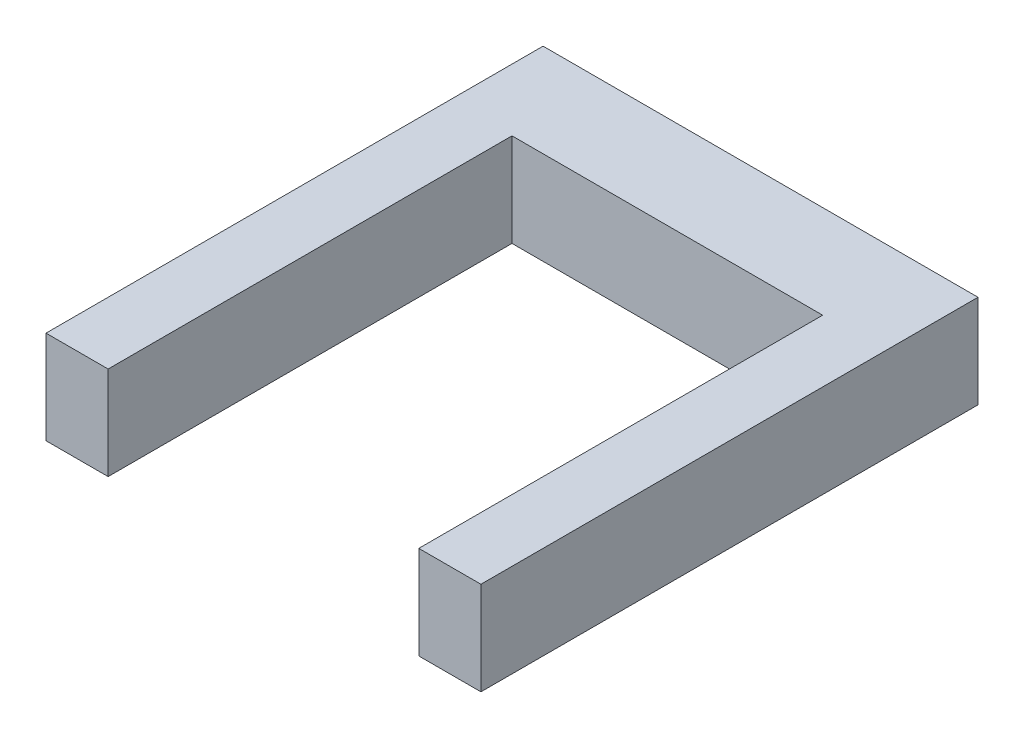
ISO-10303-21;
HEADER;
FILE_DESCRIPTION(('STEP AP214'),'2;1');
FILE_NAME('part.step','',(''),(''),'','','');
FILE_SCHEMA(('AUTOMOTIVE_DESIGN { 1 0 10303 214 1 1 1 1 }'));
ENDSEC;
DATA;
#1=APPLICATION_CONTEXT('core data for automotive mechanical design processes');
#2=APPLICATION_PROTOCOL_DEFINITION('international standard','automotive_design',2000,#1);
#3=PRODUCT_CONTEXT('',#1,'mechanical');
#4=PRODUCT('Part','Part','',(#3));
#5=PRODUCT_RELATED_PRODUCT_CATEGORY('part','',(#4));
#6=PRODUCT_DEFINITION_FORMATION('','',#4);
#7=PRODUCT_DEFINITION_CONTEXT('part definition',#1,'design');
#8=PRODUCT_DEFINITION('design','',#6,#7);
#9=PRODUCT_DEFINITION_SHAPE('','',#8);
#10=(LENGTH_UNIT() NAMED_UNIT(*) SI_UNIT(.MILLI.,.METRE.));
#11=(NAMED_UNIT(*) PLANE_ANGLE_UNIT() SI_UNIT($,.RADIAN.));
#12=(NAMED_UNIT(*) SI_UNIT($,.STERADIAN.) SOLID_ANGLE_UNIT());
#13=UNCERTAINTY_MEASURE_WITH_UNIT(LENGTH_MEASURE(1.E-05),#10,'distance_accuracy_value','');
#14=(GEOMETRIC_REPRESENTATION_CONTEXT(3) GLOBAL_UNCERTAINTY_ASSIGNED_CONTEXT((#13)) GLOBAL_UNIT_ASSIGNED_CONTEXT((#10,
#11,#12)) REPRESENTATION_CONTEXT('',''));
#15=CARTESIAN_POINT('',(0.,0.,0.));
#16=DIRECTION('',(0.,0.,1.));
#17=DIRECTION('',(1.,0.,0.));
#18=AXIS2_PLACEMENT_3D('',#15,#16,#17);
#19=CARTESIAN_POINT('',(-355.6,152.4,406.4));
#20=DIRECTION('',(0.,0.,-1.));
#21=DIRECTION('',(-1.,0.,0.));
#22=AXIS2_PLACEMENT_3D('',#19,#20,#21);
#23=PLANE('',#22);
#24=DIRECTION('',(1.,0.,0.));
#25=VECTOR('',#24,1.);
#26=CARTESIAN_POINT('',(-355.6,0.,406.4));
#27=LINE('',#26,#25);
#28=CARTESIAN_POINT('',(-355.6,0.,406.4));
#29=VERTEX_POINT('',#28);
#30=CARTESIAN_POINT('',(-254.,0.,406.4));
#31=VERTEX_POINT('',#30);
#32=EDGE_CURVE('E121',#29,#31,#27,.T.);
#33=ORIENTED_EDGE('',*,*,#32,.T.);
#34=DIRECTION('',(0.,1.,0.));
#35=VECTOR('',#34,1.);
#36=CARTESIAN_POINT('',(-254.,0.,406.4));
#37=LINE('',#36,#35);
#38=CARTESIAN_POINT('',(-254.,152.4,406.4));
#39=VERTEX_POINT('',#38);
#40=EDGE_CURVE('E109',#31,#39,#37,.T.);
#41=ORIENTED_EDGE('',*,*,#40,.T.);
#42=DIRECTION('',(1.,0.,0.));
#43=VECTOR('',#42,1.);
#44=CARTESIAN_POINT('',(-355.6,152.4,406.4));
#45=LINE('',#44,#43);
#46=CARTESIAN_POINT('',(-355.6,152.4,406.4));
#47=VERTEX_POINT('',#46);
#48=EDGE_CURVE('E87',#47,#39,#45,.T.);
#49=ORIENTED_EDGE('',*,*,#48,.F.);
#50=DIRECTION('',(0.,-1.,0.));
#51=VECTOR('',#50,1.);
#52=CARTESIAN_POINT('',(-355.6,152.4,406.4));
#53=LINE('',#52,#51);
#54=EDGE_CURVE('E11',#47,#29,#53,.T.);
#55=ORIENTED_EDGE('',*,*,#54,.T.);
#56=EDGE_LOOP('',(#33,#41,#49,#55));
#57=FACE_BOUND('',#56,.T.);
#58=ADVANCED_FACE('F35',(#57),#23,.F.);
#59=CARTESIAN_POINT('',(-355.6,152.4,-406.4));
#60=DIRECTION('',(1.,0.,0.));
#61=DIRECTION('',(0.,0.,-1.));
#62=AXIS2_PLACEMENT_3D('',#59,#60,#61);
#63=PLANE('',#62);
#64=DIRECTION('',(0.,0.,1.));
#65=VECTOR('',#64,1.);
#66=CARTESIAN_POINT('',(-355.6,0.,-406.4));
#67=LINE('',#66,#65);
#68=CARTESIAN_POINT('',(-355.6,0.,-406.4));
#69=VERTEX_POINT('',#68);
#70=EDGE_CURVE('E132',#69,#29,#67,.T.);
#71=ORIENTED_EDGE('',*,*,#70,.T.);
#72=ORIENTED_EDGE('',*,*,#54,.F.);
#73=DIRECTION('',(0.,0.,1.));
#74=VECTOR('',#73,1.);
#75=CARTESIAN_POINT('',(-355.6,152.4,-406.4));
#76=LINE('',#75,#74);
#77=CARTESIAN_POINT('',(-355.6,152.4,-406.4));
#78=VERTEX_POINT('',#77);
#79=EDGE_CURVE('E137',#78,#47,#76,.T.);
#80=ORIENTED_EDGE('',*,*,#79,.F.);
#81=DIRECTION('',(0.,-1.,0.));
#82=VECTOR('',#81,1.);
#83=CARTESIAN_POINT('',(-355.6,152.4,-406.4));
#84=LINE('',#83,#82);
#85=EDGE_CURVE('E138',#78,#69,#84,.T.);
#86=ORIENTED_EDGE('',*,*,#85,.T.);
#87=EDGE_LOOP('',(#71,#72,#80,#86));
#88=FACE_BOUND('',#87,.T.);
#89=ADVANCED_FACE('F37',(#88),#63,.F.);
#90=CARTESIAN_POINT('',(254.,152.4,406.4));
#91=VERTEX_POINT('',#90);
#92=CARTESIAN_POINT('',(355.6,152.4,406.4));
#93=VERTEX_POINT('',#92);
#94=EDGE_CURVE('E163',#91,#93,#45,.T.);
#95=ORIENTED_EDGE('',*,*,#94,.F.);
#96=DIRECTION('',(0.,1.,0.));
#97=VECTOR('',#96,1.);
#98=CARTESIAN_POINT('',(254.,0.,406.4));
#99=LINE('',#98,#97);
#100=CARTESIAN_POINT('',(254.,0.,406.4));
#101=VERTEX_POINT('',#100);
#102=EDGE_CURVE('E116',#101,#91,#99,.T.);
#103=ORIENTED_EDGE('',*,*,#102,.F.);
#104=CARTESIAN_POINT('',(355.6,0.,406.4));
#105=VERTEX_POINT('',#104);
#106=EDGE_CURVE('E129',#101,#105,#27,.T.);
#107=ORIENTED_EDGE('',*,*,#106,.T.);
#108=DIRECTION('',(0.,-1.,0.));
#109=VECTOR('',#108,1.);
#110=CARTESIAN_POINT('',(355.6,152.4,406.4));
#111=LINE('',#110,#109);
#112=EDGE_CURVE('E43',#93,#105,#111,.T.);
#113=ORIENTED_EDGE('',*,*,#112,.F.);
#114=EDGE_LOOP('',(#95,#103,#107,#113));
#115=FACE_BOUND('',#114,.T.);
#116=ADVANCED_FACE('F178',(#115),#23,.F.);
#117=CARTESIAN_POINT('',(355.6,152.4,-406.4));
#118=DIRECTION('',(-1.,0.,0.));
#119=DIRECTION('',(0.,0.,1.));
#120=AXIS2_PLACEMENT_3D('',#117,#118,#119);
#121=PLANE('',#120);
#122=DIRECTION('',(0.,0.,-1.));
#123=VECTOR('',#122,1.);
#124=CARTESIAN_POINT('',(355.6,0.,-406.4));
#125=LINE('',#124,#123);
#126=CARTESIAN_POINT('',(355.6,0.,-406.4));
#127=VERTEX_POINT('',#126);
#128=EDGE_CURVE('E128',#105,#127,#125,.T.);
#129=ORIENTED_EDGE('',*,*,#128,.T.);
#130=DIRECTION('',(0.,-1.,0.));
#131=VECTOR('',#130,1.);
#132=CARTESIAN_POINT('',(355.6,152.4,-406.4));
#133=LINE('',#132,#131);
#134=CARTESIAN_POINT('',(355.6,152.4,-406.4));
#135=VERTEX_POINT('',#134);
#136=EDGE_CURVE('E140',#135,#127,#133,.T.);
#137=ORIENTED_EDGE('',*,*,#136,.F.);
#138=DIRECTION('',(0.,0.,-1.));
#139=VECTOR('',#138,1.);
#140=CARTESIAN_POINT('',(355.6,152.4,-406.4));
#141=LINE('',#140,#139);
#142=EDGE_CURVE('E148',#93,#135,#141,.T.);
#143=ORIENTED_EDGE('',*,*,#142,.F.);
#144=ORIENTED_EDGE('',*,*,#112,.T.);
#145=EDGE_LOOP('',(#129,#137,#143,#144));
#146=FACE_BOUND('',#145,.T.);
#147=ADVANCED_FACE('F146',(#146),#121,.F.);
#148=CARTESIAN_POINT('',(-355.6,152.4,-406.4));
#149=DIRECTION('',(0.,0.,1.));
#150=DIRECTION('',(1.,0.,0.));
#151=AXIS2_PLACEMENT_3D('',#148,#149,#150);
#152=PLANE('',#151);
#153=DIRECTION('',(-1.,0.,0.));
#154=VECTOR('',#153,1.);
#155=CARTESIAN_POINT('',(-355.6,0.,-406.4));
#156=LINE('',#155,#154);
#157=EDGE_CURVE('E80',#127,#69,#156,.T.);
#158=ORIENTED_EDGE('',*,*,#157,.T.);
#159=ORIENTED_EDGE('',*,*,#85,.F.);
#160=DIRECTION('',(-1.,0.,0.));
#161=VECTOR('',#160,1.);
#162=CARTESIAN_POINT('',(-355.6,152.4,-406.4));
#163=LINE('',#162,#161);
#164=EDGE_CURVE('E59',#135,#78,#163,.T.);
#165=ORIENTED_EDGE('',*,*,#164,.F.);
#166=ORIENTED_EDGE('',*,*,#136,.T.);
#167=EDGE_LOOP('',(#158,#159,#165,#166));
#168=FACE_BOUND('',#167,.T.);
#169=ADVANCED_FACE('F167',(#168),#152,.F.);
#170=CARTESIAN_POINT('',(0.,152.4,0.));
#171=DIRECTION('',(0.,1.,0.));
#172=DIRECTION('',(0.,0.,1.));
#173=AXIS2_PLACEMENT_3D('',#170,#171,#172);
#174=PLANE('',#173);
#175=DIRECTION('',(0.,0.,1.));
#176=VECTOR('',#175,1.);
#177=CARTESIAN_POINT('',(-254.,152.4,406.4));
#178=LINE('',#177,#176);
#179=CARTESIAN_POINT('',(-254.,152.4,-254.));
#180=VERTEX_POINT('',#179);
#181=EDGE_CURVE('E114',#180,#39,#178,.T.);
#182=ORIENTED_EDGE('',*,*,#181,.F.);
#183=DIRECTION('',(-1.,0.,0.));
#184=VECTOR('',#183,1.);
#185=CARTESIAN_POINT('',(-254.,152.4,-254.));
#186=LINE('',#185,#184);
#187=CARTESIAN_POINT('',(254.,152.4,-254.));
#188=VERTEX_POINT('',#187);
#189=EDGE_CURVE('E124',#188,#180,#186,.T.);
#190=ORIENTED_EDGE('',*,*,#189,.F.);
#191=DIRECTION('',(0.,0.,-1.));
#192=VECTOR('',#191,1.);
#193=CARTESIAN_POINT('',(254.,152.4,406.4));
#194=LINE('',#193,#192);
#195=EDGE_CURVE('E170',#91,#188,#194,.T.);
#196=ORIENTED_EDGE('',*,*,#195,.F.);
#197=ORIENTED_EDGE('',*,*,#94,.T.);
#198=ORIENTED_EDGE('',*,*,#142,.T.);
#199=ORIENTED_EDGE('',*,*,#164,.T.);
#200=ORIENTED_EDGE('',*,*,#79,.T.);
#201=ORIENTED_EDGE('',*,*,#48,.T.);
#202=EDGE_LOOP('',(#182,#190,#196,#197,#198,#199,#200,#201));
#203=FACE_BOUND('',#202,.T.);
#204=ADVANCED_FACE('F165',(#203),#174,.T.);
#205=CARTESIAN_POINT('',(0.,0.,0.));
#206=DIRECTION('',(0.,1.,0.));
#207=DIRECTION('',(0.,0.,1.));
#208=AXIS2_PLACEMENT_3D('',#205,#206,#207);
#209=PLANE('',#208);
#210=DIRECTION('',(-1.,0.,0.));
#211=VECTOR('',#210,1.);
#212=CARTESIAN_POINT('',(-254.,0.,-254.));
#213=LINE('',#212,#211);
#214=CARTESIAN_POINT('',(254.,0.,-254.));
#215=VERTEX_POINT('',#214);
#216=CARTESIAN_POINT('',(-254.,0.,-254.));
#217=VERTEX_POINT('',#216);
#218=EDGE_CURVE('E50',#215,#217,#213,.T.);
#219=ORIENTED_EDGE('',*,*,#218,.T.);
#220=DIRECTION('',(0.,0.,1.));
#221=VECTOR('',#220,1.);
#222=CARTESIAN_POINT('',(-254.,0.,406.4));
#223=LINE('',#222,#221);
#224=EDGE_CURVE('E112',#217,#31,#223,.T.);
#225=ORIENTED_EDGE('',*,*,#224,.T.);
#226=ORIENTED_EDGE('',*,*,#32,.F.);
#227=ORIENTED_EDGE('',*,*,#70,.F.);
#228=ORIENTED_EDGE('',*,*,#157,.F.);
#229=ORIENTED_EDGE('',*,*,#128,.F.);
#230=ORIENTED_EDGE('',*,*,#106,.F.);
#231=DIRECTION('',(0.,0.,-1.));
#232=VECTOR('',#231,1.);
#233=CARTESIAN_POINT('',(254.,0.,406.4));
#234=LINE('',#233,#232);
#235=EDGE_CURVE('E123',#101,#215,#234,.T.);
#236=ORIENTED_EDGE('',*,*,#235,.T.);
#237=EDGE_LOOP('',(#219,#225,#226,#227,#228,#229,#230,#236));
#238=FACE_BOUND('',#237,.T.);
#239=ADVANCED_FACE('F119',(#238),#209,.F.);
#240=CARTESIAN_POINT('',(-254.,0.,406.4));
#241=DIRECTION('',(-1.,0.,0.));
#242=DIRECTION('',(0.,0.,1.));
#243=AXIS2_PLACEMENT_3D('',#240,#241,#242);
#244=PLANE('',#243);
#245=ORIENTED_EDGE('',*,*,#181,.T.);
#246=ORIENTED_EDGE('',*,*,#40,.F.);
#247=ORIENTED_EDGE('',*,*,#224,.F.);
#248=DIRECTION('',(0.,1.,0.));
#249=VECTOR('',#248,1.);
#250=CARTESIAN_POINT('',(-254.,0.,-254.));
#251=LINE('',#250,#249);
#252=EDGE_CURVE('E153',#217,#180,#251,.T.);
#253=ORIENTED_EDGE('',*,*,#252,.T.);
#254=EDGE_LOOP('',(#245,#246,#247,#253));
#255=FACE_BOUND('',#254,.T.);
#256=ADVANCED_FACE('F111',(#255),#244,.F.);
#257=CARTESIAN_POINT('',(-254.,0.,-254.));
#258=DIRECTION('',(0.,0.,-1.));
#259=DIRECTION('',(-1.,0.,0.));
#260=AXIS2_PLACEMENT_3D('',#257,#258,#259);
#261=PLANE('',#260);
#262=ORIENTED_EDGE('',*,*,#189,.T.);
#263=ORIENTED_EDGE('',*,*,#252,.F.);
#264=ORIENTED_EDGE('',*,*,#218,.F.);
#265=DIRECTION('',(0.,1.,0.));
#266=VECTOR('',#265,1.);
#267=CARTESIAN_POINT('',(254.,0.,-254.));
#268=LINE('',#267,#266);
#269=EDGE_CURVE('E154',#215,#188,#268,.T.);
#270=ORIENTED_EDGE('',*,*,#269,.T.);
#271=EDGE_LOOP('',(#262,#263,#264,#270));
#272=FACE_BOUND('',#271,.T.);
#273=ADVANCED_FACE('F237',(#272),#261,.F.);
#274=CARTESIAN_POINT('',(254.,0.,406.4));
#275=DIRECTION('',(1.,0.,0.));
#276=DIRECTION('',(0.,0.,-1.));
#277=AXIS2_PLACEMENT_3D('',#274,#275,#276);
#278=PLANE('',#277);
#279=ORIENTED_EDGE('',*,*,#195,.T.);
#280=ORIENTED_EDGE('',*,*,#269,.F.);
#281=ORIENTED_EDGE('',*,*,#235,.F.);
#282=ORIENTED_EDGE('',*,*,#102,.T.);
#283=EDGE_LOOP('',(#279,#280,#281,#282));
#284=FACE_BOUND('',#283,.T.);
#285=ADVANCED_FACE('F177',(#284),#278,.F.);
#286=CLOSED_SHELL('',(#58,#89,#116,#147,#169,#204,#239,#256,#273,#285));
#287=MANIFOLD_SOLID_BREP('B2',#286);
#288=ADVANCED_BREP_SHAPE_REPRESENTATION('',(#18,#287),#14);
#289=SHAPE_DEFINITION_REPRESENTATION(#9,#288);
ENDSEC;
END-ISO-10303-21;
